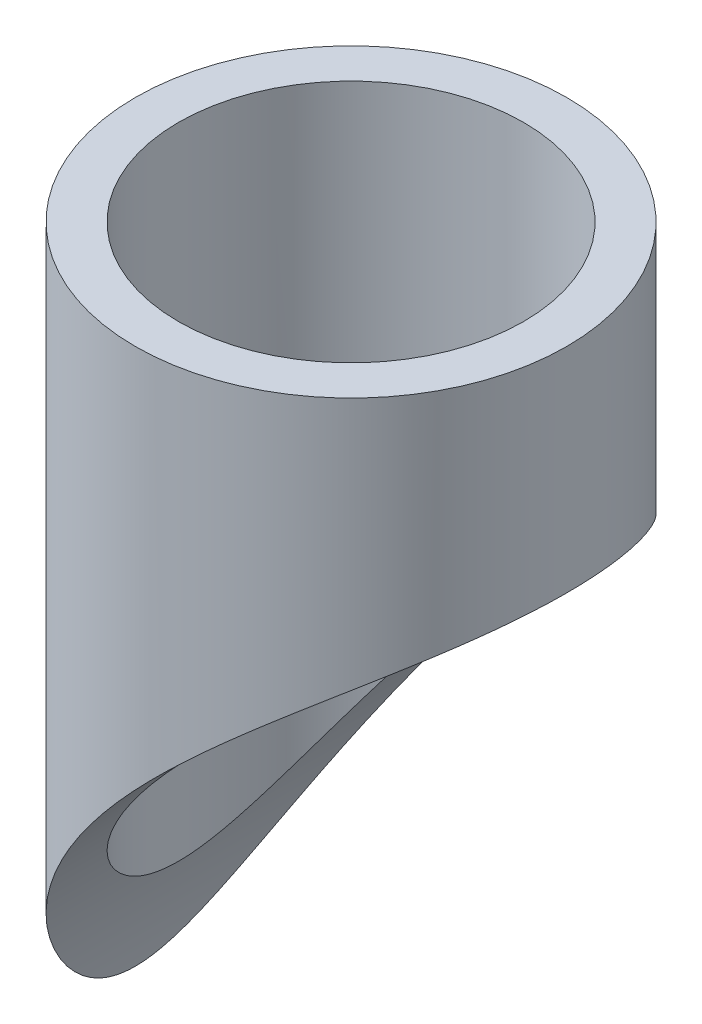
ISO-10303-21;
HEADER;
FILE_DESCRIPTION(('STEP AP214'),'2;1');
FILE_NAME('part.step','',(''),(''),'','','');
FILE_SCHEMA(('AUTOMOTIVE_DESIGN { 1 0 10303 214 1 1 1 1 }'));
ENDSEC;
DATA;
#1=APPLICATION_CONTEXT('core data for automotive mechanical design processes');
#2=APPLICATION_PROTOCOL_DEFINITION('international standard','automotive_design',2000,#1);
#3=PRODUCT_CONTEXT('',#1,'mechanical');
#4=PRODUCT('Part','Part','',(#3));
#5=PRODUCT_RELATED_PRODUCT_CATEGORY('part','',(#4));
#6=PRODUCT_DEFINITION_FORMATION('','',#4);
#7=PRODUCT_DEFINITION_CONTEXT('part definition',#1,'design');
#8=PRODUCT_DEFINITION('design','',#6,#7);
#9=PRODUCT_DEFINITION_SHAPE('','',#8);
#10=(LENGTH_UNIT() NAMED_UNIT(*) SI_UNIT(.MILLI.,.METRE.));
#11=(NAMED_UNIT(*) PLANE_ANGLE_UNIT() SI_UNIT($,.RADIAN.));
#12=(NAMED_UNIT(*) SI_UNIT($,.STERADIAN.) SOLID_ANGLE_UNIT());
#13=UNCERTAINTY_MEASURE_WITH_UNIT(LENGTH_MEASURE(1.E-05),#10,'distance_accuracy_value','');
#14=(GEOMETRIC_REPRESENTATION_CONTEXT(3) GLOBAL_UNCERTAINTY_ASSIGNED_CONTEXT((#13)) GLOBAL_UNIT_ASSIGNED_CONTEXT((#10,
#11,#12)) REPRESENTATION_CONTEXT('',''));
#15=CARTESIAN_POINT('',(0.,0.,0.));
#16=DIRECTION('',(0.,0.,1.));
#17=DIRECTION('',(1.,0.,0.));
#18=AXIS2_PLACEMENT_3D('',#15,#16,#17);
#19=CARTESIAN_POINT('',(0.,76.2,0.));
#20=DIRECTION('',(0.,1.,0.));
#21=DIRECTION('',(0.,0.,1.));
#22=AXIS2_PLACEMENT_3D('',#19,#20,#21);
#23=PLANE('',#22);
#24=CARTESIAN_POINT('',(0.,76.2,0.));
#25=DIRECTION('',(0.,1.,0.));
#26=DIRECTION('',(0.,0.,1.));
#27=AXIS2_PLACEMENT_3D('',#24,#25,#26);
#28=CIRCLE('',#27,15.875);
#29=CARTESIAN_POINT('',(0.,76.2,15.875));
#30=VERTEX_POINT('',#29);
#31=EDGE_CURVE('E10',#30,#30,#28,.T.);
#32=ORIENTED_EDGE('',*,*,#31,.T.);
#33=EDGE_LOOP('',(#32));
#34=FACE_BOUND('',#33,.T.);
#35=CARTESIAN_POINT('',(0.,76.2,0.));
#36=DIRECTION('',(0.,1.,0.));
#37=DIRECTION('',(0.,0.,1.));
#38=AXIS2_PLACEMENT_3D('',#35,#36,#37);
#39=CIRCLE('',#38,12.7);
#40=CARTESIAN_POINT('',(0.,76.2,12.7));
#41=VERTEX_POINT('',#40);
#42=EDGE_CURVE('E45',#41,#41,#39,.T.);
#43=ORIENTED_EDGE('',*,*,#42,.F.);
#44=EDGE_LOOP('',(#43));
#45=FACE_BOUND('',#44,.T.);
#46=ADVANCED_FACE('F31',(#34,#45),#23,.T.);
#47=CARTESIAN_POINT('',(0.,76.2,0.));
#48=DIRECTION('',(0.,-1.,0.));
#49=DIRECTION('',(0.,0.,-1.));
#50=AXIS2_PLACEMENT_3D('',#47,#48,#49);
#51=CYLINDRICAL_SURFACE('',#50,15.875);
#52=ORIENTED_EDGE('',*,*,#31,.F.);
#53=EDGE_LOOP('',(#52));
#54=FACE_BOUND('',#53,.T.);
#55=CARTESIAN_POINT('',(0.,47.9414486639693,-15.875));
#56=CARTESIAN_POINT('',(-0.66666065135991,47.2350268969374,-15.8750045128508));
#57=CARTESIAN_POINT('',(-1.31875367673351,46.514456727453,-15.8330474446576));
#58=CARTESIAN_POINT('',(-2.58879091738679,45.0510828408319,-15.6755798825106));
#59=CARTESIAN_POINT('',(-3.20670434630285,44.3082599793599,-15.5600042143886));
#60=CARTESIAN_POINT('',(-4.40802378042113,42.8022054103682,-15.26333797029));
#61=CARTESIAN_POINT('',(-4.99125279163666,42.0388938049038,-15.0819401754127));
#62=CARTESIAN_POINT('',(-6.11835287787962,40.4997928206583,-14.6609440469602));
#63=CARTESIAN_POINT('',(-6.66223383073967,39.7240066336529,-14.4213603864714));
#64=CARTESIAN_POINT('',(-7.52141247118628,38.4447299536941,-13.9851800542793));
#65=CARTESIAN_POINT('',(-7.84851707547663,37.943748029368,-13.804155000241));
#66=CARTESIAN_POINT('',(-8.4863624260355,36.9391885914301,-13.4214618279639));
#67=CARTESIAN_POINT('',(-8.79710220074957,36.4356109256572,-13.2197924861936));
#68=CARTESIAN_POINT('',(-9.4023771474737,35.4265818334641,-12.7963842438004));
#69=CARTESIAN_POINT('',(-9.69689974260107,34.9211292684219,-12.5746301097533));
#70=CARTESIAN_POINT('',(-10.2694647630176,33.9098886006426,-12.1115358224614));
#71=CARTESIAN_POINT('',(-10.5475077615438,33.4041005101961,-11.8701963511785));
#72=CARTESIAN_POINT('',(-11.0871496645307,32.3933858330129,-11.3677919023488));
#73=CARTESIAN_POINT('',(-11.3487451701882,31.8884594451784,-11.1067228721572));
#74=CARTESIAN_POINT('',(-11.8553755410638,30.8811307517034,-10.5642550021301));
#75=CARTESIAN_POINT('',(-12.1004088034614,30.3787286946991,-10.2828542001123));
#76=CARTESIAN_POINT('',(-12.5734173411913,29.3792066050073,-9.69875743402519));
#77=CARTESIAN_POINT('',(-12.801412669277,28.8820809731921,-9.39608734402429));
#78=CARTESIAN_POINT('',(-13.240252726423,27.8955136849343,-8.76690148894639));
#79=CARTESIAN_POINT('',(-13.4511020078049,27.4060700169431,-8.44039209724893));
#80=CARTESIAN_POINT('',(-13.8164988587507,26.5313134400782,-7.82448318507253));
#81=CARTESIAN_POINT('',(-13.9741206523707,26.1439238690001,-7.5398614486379));
#82=CARTESIAN_POINT('',(-14.2771055144478,25.380333162619,-6.94912472428214));
#83=CARTESIAN_POINT('',(-14.4224619025835,25.0041381957128,-6.64299818803477));
#84=CARTESIAN_POINT('',(-14.6298574673211,24.4539264460913,-6.16544009326816));
#85=CARTESIAN_POINT('',(-14.6970276936404,24.2733976442888,-6.0037125755573));
#86=CARTESIAN_POINT('',(-14.8277702780036,23.9176529451846,-5.67313651696569));
#87=CARTESIAN_POINT('',(-14.8913431576044,23.7424362794279,-5.50428901459432));
#88=CARTESIAN_POINT('',(-15.0145261994738,23.3988017682531,-5.15880050222244));
#89=CARTESIAN_POINT('',(-15.0741407316203,23.2303765088648,-4.98216845709812));
#90=CARTESIAN_POINT('',(-15.1890566443287,22.9019026222129,-4.6199867485452));
#91=CARTESIAN_POINT('',(-15.2443594492054,22.7418512345615,-4.4344400629507));
#92=CARTESIAN_POINT('',(-15.3345096453927,22.4780434789594,-4.10948611620984));
#93=CARTESIAN_POINT('',(-15.3705807859744,22.3716018826797,-3.97260384630213));
#94=CARTESIAN_POINT('',(-15.4400346656773,22.1651123622437,-3.69345612619952));
#95=CARTESIAN_POINT('',(-15.4734174702423,22.0650642824586,-3.55119080717138));
#96=CARTESIAN_POINT('',(-15.5691647138832,21.7760743379903,-3.11536774715303));
#97=CARTESIAN_POINT('',(-15.6270558920996,21.5984989458554,-2.81303720721557));
#98=CARTESIAN_POINT('',(-15.7281586289646,21.2850753776152,-2.17825771381201));
#99=CARTESIAN_POINT('',(-15.7711350593105,21.1498985347196,-1.84542256659295));
#100=CARTESIAN_POINT('',(-15.8200536462718,20.9950916332291,-1.33088154399303));
#101=CARTESIAN_POINT('',(-15.8337618954994,20.9515052995447,-1.15703062139832));
#102=CARTESIAN_POINT('',(-15.8555309637987,20.8821463356121,-0.805421447664819));
#103=CARTESIAN_POINT('',(-15.8635932852847,20.856368966319,-0.627664249004634));
#104=CARTESIAN_POINT('',(-15.8731382514911,20.8258338152418,-0.290360150437818));
#105=CARTESIAN_POINT('',(-15.8752589751626,20.8190378810528,-0.13101389303826));
#106=CARTESIAN_POINT('',(-15.8746906451783,20.8208580877462,0.187574548862955));
#107=CARTESIAN_POINT('',(-15.8720020104055,20.829472886393,0.346816741219976));
#108=CARTESIAN_POINT('',(-15.8619106584243,20.86174600207,0.663770600228167));
#109=CARTESIAN_POINT('',(-15.8545029197951,20.8854203433535,0.821480454675322));
#110=CARTESIAN_POINT('',(-15.8352257624824,20.9468426584602,1.133921313059));
#111=CARTESIAN_POINT('',(-15.8233535634376,20.9845994023538,1.28865039738541));
#112=CARTESIAN_POINT('',(-15.7933774004104,21.0795496712737,1.6174422291888));
#113=CARTESIAN_POINT('',(-15.7745975540601,21.13883420337,1.7908373189623));
#114=CARTESIAN_POINT('',(-15.7322020785145,21.2718942934136,2.13141674852351));
#115=CARTESIAN_POINT('',(-15.7085827251764,21.3456810094244,2.29859618742624));
#116=CARTESIAN_POINT('',(-15.6313332633482,21.5853745206631,2.79059444248092));
#117=CARTESIAN_POINT('',(-15.5713416272364,21.7695185267103,3.10556698064165));
#118=CARTESIAN_POINT('',(-15.442950071752,22.1570089314821,3.68977112018473));
#119=CARTESIAN_POINT('',(-15.3753858384714,22.3582340667913,3.96065409238582));
#120=CARTESIAN_POINT('',(-15.2310568996593,22.7809562072674,4.48376197985572));
#121=CARTESIAN_POINT('',(-15.1542836067887,23.0024720871088,4.73596912016705));
#122=CARTESIAN_POINT('',(-14.9927423400133,23.4605363715501,5.22492075875693));
#123=CARTESIAN_POINT('',(-14.9079511926085,23.6971276625542,5.46161686858621));
#124=CARTESIAN_POINT('',(-14.7315037384017,24.1807949047832,5.92105467399209));
#125=CARTESIAN_POINT('',(-14.6398498015873,24.4278672238422,6.14380113856841));
#126=CARTESIAN_POINT('',(-14.4075244605822,25.0430140078842,6.67509215580451));
#127=CARTESIAN_POINT('',(-14.2633770541851,25.4154408768356,6.97706457446801));
#128=CARTESIAN_POINT('',(-13.9629537974177,26.1715130731179,7.56036114498434));
#129=CARTESIAN_POINT('',(-13.806672968245,26.5551629650075,7.84167672744087));
#130=CARTESIAN_POINT('',(-13.4824252828439,27.3307382754771,8.38692816574423));
#131=CARTESIAN_POINT('',(-13.3144409148361,27.722675456257,8.65083677533946));
#132=CARTESIAN_POINT('',(-12.9674197743992,28.5118309134827,9.16281806378762));
#133=CARTESIAN_POINT('',(-12.7883846502163,28.909048395458,9.41089309308302));
#134=CARTESIAN_POINT('',(-12.4189722531972,29.7082207041605,9.89329449681348));
#135=CARTESIAN_POINT('',(-12.2285656774532,30.1101854220727,10.127581964284));
#136=CARTESIAN_POINT('',(-11.8369795925162,30.9165360366939,10.5826095091102));
#137=CARTESIAN_POINT('',(-11.6357997439983,31.3209220093084,10.8033491592809));
#138=CARTESIAN_POINT('',(-11.2229188655453,32.1307711296429,11.2316567088521));
#139=CARTESIAN_POINT('',(-11.0112267490892,32.5362330979062,11.4392354386373));
#140=CARTESIAN_POINT('',(-10.5771910872255,33.3477840154308,11.8417163315733));
#141=CARTESIAN_POINT('',(-10.3548468160334,33.7538730055845,12.0366176288082));
#142=CARTESIAN_POINT('',(-9.89097283657847,34.5812317152349,12.4208844977213));
#143=CARTESIAN_POINT('',(-9.64903612336731,35.0024982798607,12.6097665956041));
#144=CARTESIAN_POINT('',(-9.15373385733811,35.8442587453432,12.9737894717217));
#145=CARTESIAN_POINT('',(-8.90036755368368,36.2647525935444,13.1489293451213));
#146=CARTESIAN_POINT('',(-8.12300472591021,37.5243285112409,13.6533657985792));
#147=CARTESIAN_POINT('',(-7.58179697303059,38.3614106937945,13.9616354473012));
#148=CARTESIAN_POINT('',(-6.45551210035947,40.0229165356587,14.5167152278554));
#149=CARTESIAN_POINT('',(-5.87055449705109,40.8473677668844,14.7636853738333));
#150=CARTESIAN_POINT('',(-4.6565144012067,42.4809612750072,15.19033473294));
#151=CARTESIAN_POINT('',(-4.02744740496635,43.2901088027337,15.3700374388964));
#152=CARTESIAN_POINT('',(-2.89103776783719,44.6865659913839,15.617463415055));
#153=CARTESIAN_POINT('',(-2.39292474717176,45.2784366798749,15.701988814606));
#154=CARTESIAN_POINT('',(-1.37467113806686,46.4481120253193,15.8236788428069));
#155=CARTESIAN_POINT('',(-0.854530588114299,47.0259167068463,15.8608435542027));
#156=CARTESIAN_POINT('',(0.205135750647502,48.1641628995572,15.8825145919074));
#157=CARTESIAN_POINT('',(0.744653150092596,48.7246117339521,15.8670434417677));
#158=CARTESIAN_POINT('',(1.83971045675661,49.8248365138395,15.777601679473));
#159=CARTESIAN_POINT('',(2.3952461588794,50.3646177998631,15.7036462881745));
#160=CARTESIAN_POINT('',(3.3891469934105,51.2989951073759,15.5152633901721));
#161=CARTESIAN_POINT('',(3.82529980387192,51.698597590999,15.4139342842937));
#162=CARTESIAN_POINT('',(4.7010984984568,52.4810293378575,15.1697710502473));
#163=CARTESIAN_POINT('',(5.14074422697473,52.8638593433928,15.0269387610261));
#164=CARTESIAN_POINT('',(6.01925745534077,53.6100656582846,14.6970727953055));
#165=CARTESIAN_POINT('',(6.45812526772586,53.9734639117534,14.5100903278931));
#166=CARTESIAN_POINT('',(7.11244419444058,54.5022826542545,14.1946259938396));
#167=CARTESIAN_POINT('',(7.32987811447742,54.6758358666363,14.0836445662315));
#168=CARTESIAN_POINT('',(7.76284946320285,55.0172897978307,13.8497060074125));
#169=CARTESIAN_POINT('',(7.97838639511147,55.1851890667292,13.7267458353377));
#170=CARTESIAN_POINT('',(8.53756348250257,55.6156300243116,13.3898388281348));
#171=CARTESIAN_POINT('',(8.87909834445058,55.8733898923915,13.1661641697728));
#172=CARTESIAN_POINT('',(9.5517626050313,56.3718073749593,12.6866086926024));
#173=CARTESIAN_POINT('',(9.8828941340963,56.6124685038915,12.4307345221609));
#174=CARTESIAN_POINT('',(10.5311497052201,57.0753959420346,11.8865291833914));
#175=CARTESIAN_POINT('',(10.8482735273705,57.2976619625067,11.5981975057617));
#176=CARTESIAN_POINT('',(11.4645196234674,57.7224616249204,10.9894487153382));
#177=CARTESIAN_POINT('',(11.7636415842187,57.9249949235913,10.6690310445726));
#178=CARTESIAN_POINT('',(12.3418498459457,58.3105037355934,9.99465190667703));
#179=CARTESIAN_POINT('',(12.6207722905057,58.4933241566574,9.64046068926702));
#180=CARTESIAN_POINT('',(13.1518503632201,58.8365477634936,8.9023120685481));
#181=CARTESIAN_POINT('',(13.4040052646117,58.9969503406386,8.51835385752812));
#182=CARTESIAN_POINT('',(13.8772714236556,59.2942892558562,7.72339611914459));
#183=CARTESIAN_POINT('',(14.0983964709165,59.4312360236522,7.31240872351999));
#184=CARTESIAN_POINT('',(14.505851781255,59.6809389493783,6.46654196057116));
#185=CARTESIAN_POINT('',(14.6921872962065,59.793698758987,6.03166621231331));
#186=CARTESIAN_POINT('',(15.005452163152,59.9816791913232,5.19848625540537));
#187=CARTESIAN_POINT('',(15.1369196335125,60.0598478078819,4.80254510643648));
#188=CARTESIAN_POINT('',(15.3688957579708,60.1969894815053,3.99846206945098));
#189=CARTESIAN_POINT('',(15.4694071694962,60.2559642482992,3.5903212716797));
#190=CARTESIAN_POINT('',(15.6379726228009,60.3544851175854,2.76526072161523));
#191=CARTESIAN_POINT('',(15.7060397185789,60.3940390342669,2.34834457071411));
#192=CARTESIAN_POINT('',(15.8087681015191,60.4536164545046,1.50903641444847));
#193=CARTESIAN_POINT('',(15.8434307511566,60.4736407546206,1.08664463313206));
#194=CARTESIAN_POINT('',(15.8775182712816,60.4933309485588,0.271621901646771));
#195=CARTESIAN_POINT('',(15.8793815182309,60.4944056093163,-0.120875714094932));
#196=CARTESIAN_POINT('',(15.8540534672785,60.4797779716364,-0.904601746974085));
#197=CARTESIAN_POINT('',(15.8268640043489,60.4640767327664,-1.29583024270394));
#198=CARTESIAN_POINT('',(15.7437868981974,60.4159475267913,-2.07411064574538));
#199=CARTESIAN_POINT('',(15.6879044845395,60.3835226077316,-2.46116330102317));
#200=CARTESIAN_POINT('',(15.5481536450644,60.3020427448373,-3.22840368812439));
#201=CARTESIAN_POINT('',(15.4642849304676,60.2529876294023,-3.608591349068));
#202=CARTESIAN_POINT('',(15.2706314185859,60.1389968254308,-4.35554282757884));
#203=CARTESIAN_POINT('',(15.1611258259927,60.074231971045,-4.72240525271312));
#204=CARTESIAN_POINT('',(14.9170693446605,59.9287739661364,-5.44443669924268));
#205=CARTESIAN_POINT('',(14.7825188776715,59.8480810838368,-5.79960591743043));
#206=CARTESIAN_POINT('',(14.4899556204419,59.6710347712088,-6.49611434443514));
#207=CARTESIAN_POINT('',(14.3319416768472,59.5746805710217,-6.83745287235001));
#208=CARTESIAN_POINT('',(13.9942690570408,59.3666570983852,-7.50438402046928));
#209=CARTESIAN_POINT('',(13.8146097455178,59.254987376398,-7.82997617811009));
#210=CARTESIAN_POINT('',(13.4278245262629,59.011840186948,-8.47684772235653));
#211=CARTESIAN_POINT('',(13.2198721469286,58.8797363532134,-8.79739721983744));
#212=CARTESIAN_POINT('',(12.7850368541985,58.5999308955367,-9.41817874811295));
#213=CARTESIAN_POINT('',(12.5581535759216,58.4522289709365,-9.71841038709161));
#214=CARTESIAN_POINT('',(12.0879014264708,58.1418547095999,-10.2974451484425));
#215=CARTESIAN_POINT('',(11.8445321075478,57.9791819662235,-10.5762476883764));
#216=CARTESIAN_POINT('',(11.3437479825905,57.6395543215934,-11.1116790560152));
#217=CARTESIAN_POINT('',(11.086331507926,57.4625977223905,-11.368305240045));
#218=CARTESIAN_POINT('',(10.5337587589379,57.0769371170622,-11.8832638998662));
#219=CARTESIAN_POINT('',(10.2373912941697,56.8668249971123,-12.1392422873671));
#220=CARTESIAN_POINT('',(9.63366360876956,56.431319441915,-12.6237073965762));
#221=CARTESIAN_POINT('',(9.32630290123263,56.2059253294114,-12.8521928986278));
#222=CARTESIAN_POINT('',(8.70318230664155,55.7407541990041,-13.2820789152309));
#223=CARTESIAN_POINT('',(8.38741612800914,55.5009662284872,-13.4834584165642));
#224=CARTESIAN_POINT('',(7.75026907174175,55.0082313481802,-13.8595044151506));
#225=CARTESIAN_POINT('',(7.42888718010745,54.7552820452652,-14.034166031383));
#226=CARTESIAN_POINT('',(6.63094948438063,54.1155006083188,-14.4335750125358));
#227=CARTESIAN_POINT('',(6.15245664227602,53.7216210635852,-14.6432788093122));
#228=CARTESIAN_POINT('',(5.19456656784212,52.9108795212126,-15.0098418441656));
#229=CARTESIAN_POINT('',(4.71516901469862,52.494006736472,-15.1666760292369));
#230=CARTESIAN_POINT('',(3.76062909019786,51.6403921017693,-15.4310909887219));
#231=CARTESIAN_POINT('',(3.28548678962633,51.2036499220137,-15.5386709452825));
#232=CARTESIAN_POINT('',(2.34354346021446,50.3131613226583,-15.7083532086637));
#233=CARTESIAN_POINT('',(1.87673896909312,49.8594222154524,-15.7704748415689));
#234=CARTESIAN_POINT('',(1.1762957965288,49.1591812000264,-15.8331820578484));
#235=CARTESIAN_POINT('',(0.938545026288685,48.9180185374613,-15.8489942870651));
#236=CARTESIAN_POINT('',(0.466608354857252,48.4322907123422,-15.8698966794377));
#237=CARTESIAN_POINT('',(0.232418874441163,48.187729514113,-15.8749984266783));
#238=CARTESIAN_POINT('',(0.,47.9414486639693,-15.875));
#239=B_SPLINE_CURVE_WITH_KNOTS('',3,(#55,#56,#57,#58,#59,#60,#61,#62,#63,#64,#65,#66,#67,#68,
#69,#70,#71,#72,#73,#74,#75,#76,#77,#78,#79,#80,#81,#82,#83,#84,#85,#86,#87,#88,#89,#90,#91,#92,
#93,#94,#95,#96,#97,#98,#99,#100,#101,#102,#103,#104,#105,#106,#107,#108,#109,#110,#111,#112,
#113,#114,#115,#116,#117,#118,#119,#120,#121,#122,#123,#124,#125,#126,#127,#128,#129,#130,#131,
#132,#133,#134,#135,#136,#137,#138,#139,#140,#141,#142,#143,#144,#145,#146,#147,#148,#149,#150,
#151,#152,#153,#154,#155,#156,#157,#158,#159,#160,#161,#162,#163,#164,#165,#166,#167,#168,#169,
#170,#171,#172,#173,#174,#175,#176,#177,#178,#179,#180,#181,#182,#183,#184,#185,#186,#187,#188,
#189,#190,#191,#192,#193,#194,#195,#196,#197,#198,#199,#200,#201,#202,#203,#204,#205,#206,#207,
#208,#209,#210,#211,#212,#213,#214,#215,#216,#217,#218,#219,#220,#221,#222,#223,#224,#225,#226,
#227,#228,#229,#230,#231,#232,#233,#234,#235,#236,#237,#238),.UNSPECIFIED.,.T.,.F.,(4,2,2,2,2,2,
2,2,2,2,2,2,2,2,2,2,2,2,2,2,2,2,2,2,2,2,2,2,2,2,2,2,2,2,2,2,2,2,2,2,2,2,2,2,2,2,2,2,2,2,2,2,2,2,
2,2,2,2,2,2,2,2,2,2,2,2,2,2,2,2,2,2,2,2,2,2,2,2,2,2,2,2,2,2,2,2,2,2,2,2,2,4),(0.,
2.91361950347819,5.82982201112205,8.75981449672622,11.6890688739846,13.5638619909207,
15.4387662862201,17.3151047157014,19.191377839043,21.0680374203324,22.9448783571598,
24.8194743757091,26.6935710478311,28.2106929481234,29.7286358820966,30.4830285899826,
31.2373116414263,31.9907476488177,32.7439337059436,33.2750616986507,33.8061767578819,
34.8694185270659,35.9487324800133,36.4871399647719,37.0254041216568,37.5031243953401,
37.9808030628276,38.4589908611322,38.937476958119,39.4892338131058,40.0414168667076,
41.146738223344,42.1777996464699,43.2098301076638,44.2449402820814,45.2796946269593,
46.7807653603763,48.2824553288387,49.7864426144224,51.2902061163122,52.7980275002163,
54.3058964037971,55.8125078999992,57.3192221955591,58.8825730426139,60.4460267398059,
63.5732829473031,66.692287926635,69.8102025900183,72.1431074284387,74.4760081909312,
76.8079108012388,79.1392067202724,80.9381423029601,82.7369981895341,84.5337777733136,
85.4320959318481,86.3306427301097,87.7776158561952,89.2242907084333,90.6709882640986,
92.1177109820416,93.5750928637647,95.0325143045963,96.4892860049587,97.9458376110087,
99.2175346894612,100.489118458027,101.76019017098,103.031210038222,104.207304380352,
105.383324444639,106.559130244094,107.734948176596,108.89851183581,110.062055902646,
111.225657182777,112.389292623991,113.600852273343,114.812435280135,116.024051205858,
117.235811371361,118.56772855309,119.899704800389,121.232707752412,122.565953937176,
124.525838904434,126.486651289404,128.447496231948,130.407507058677,131.424386861961,
132.44016627562),.UNSPECIFIED.);
#240=CARTESIAN_POINT('',(0.,47.9414486639693,-15.875));
#241=VERTEX_POINT('',#240);
#242=EDGE_CURVE('E49',#241,#241,#239,.T.);
#243=ORIENTED_EDGE('',*,*,#242,.T.);
#244=EDGE_LOOP('',(#243));
#245=FACE_BOUND('',#244,.T.);
#246=ADVANCED_FACE('F33',(#54,#245),#51,.T.);
#247=CARTESIAN_POINT('',(0.,76.2,0.));
#248=DIRECTION('',(0.,-1.,0.));
#249=DIRECTION('',(0.,0.,-1.));
#250=AXIS2_PLACEMENT_3D('',#247,#248,#249);
#251=CYLINDRICAL_SURFACE('',#250,12.7);
#252=CARTESIAN_POINT('',(0.,47.9414486639693,-12.7));
#253=CARTESIAN_POINT('',(-0.538939033689647,47.3703749887611,-12.6999982291483));
#254=CARTESIAN_POINT('',(-1.06816791353537,46.7902525097512,-12.6657456535846));
#255=CARTESIAN_POINT('',(-2.10366280657467,45.6162055331657,-12.5354346776843));
#256=CARTESIAN_POINT('',(-2.60991500531772,45.0222730486733,-12.4393396087754));
#257=CARTESIAN_POINT('',(-3.59840067813975,43.8228566912171,-12.1902527535142));
#258=CARTESIAN_POINT('',(-4.08054059456745,43.2173387917118,-12.0370563095705));
#259=CARTESIAN_POINT('',(-5.01707425862054,42.0007817340923,-11.6777787939843));
#260=CARTESIAN_POINT('',(-5.47147454789113,41.389743917026,-11.4717102509097));
#261=CARTESIAN_POINT('',(-6.13845408008293,40.462161592001,-11.1209325108562));
#262=CARTESIAN_POINT('',(-6.36169395513955,40.1461237517162,-10.9947526716761));
#263=CARTESIAN_POINT('',(-6.80031109016822,39.5142314947554,-10.7290044431812));
#264=CARTESIAN_POINT('',(-7.01568895443263,39.1983770658262,-10.5894370858661));
#265=CARTESIAN_POINT('',(-7.4385409811833,38.5673333348779,-10.2968080767626));
#266=CARTESIAN_POINT('',(-7.64601054783087,38.2521445172148,-10.1437387446162));
#267=CARTESIAN_POINT('',(-8.0527307687697,37.6233804268829,-9.82397321933542));
#268=CARTESIAN_POINT('',(-8.25198157090308,37.3098051252785,-9.65727727148257));
#269=CARTESIAN_POINT('',(-8.64190342772565,36.6853921378541,-9.30997476130307));
#270=CARTESIAN_POINT('',(-8.83258036972658,36.3745526951381,-9.12937798251513));
#271=CARTESIAN_POINT('',(-9.20522212623156,35.7564823309675,-8.75350995876061));
#272=CARTESIAN_POINT('',(-9.38718625683293,35.4492516942059,-8.55823756492877));
#273=CARTESIAN_POINT('',(-9.74180472801844,34.8401553025108,-8.15228917561137));
#274=CARTESIAN_POINT('',(-9.91446831998758,34.538284424354,-7.9416289972452));
#275=CARTESIAN_POINT('',(-10.250082095222,33.9415247330161,-7.50346428755175));
#276=CARTESIAN_POINT('',(-10.4130345787695,33.6466342764302,-7.27596377407163));
#277=CARTESIAN_POINT('',(-10.7259701997453,33.0708801714891,-6.80602814096223));
#278=CARTESIAN_POINT('',(-10.8761172000323,32.7898687412518,-6.56388472665748));
#279=CARTESIAN_POINT('',(-11.1651654604265,32.2403028872902,-6.05918378765659));
#280=CARTESIAN_POINT('',(-11.3040623437686,31.971753328942,-5.79661839509074));
#281=CARTESIAN_POINT('',(-11.5680828545269,31.4535970675219,-5.24987318345957));
#282=CARTESIAN_POINT('',(-11.6932778852622,31.2038944955712,-4.96581989036305));
#283=CARTESIAN_POINT('',(-11.9280188138458,30.7292699113729,-4.37197120490409));
#284=CARTESIAN_POINT('',(-12.0375855212016,30.5043150400343,-4.06221092858774));
#285=CARTESIAN_POINT('',(-12.2260687560987,30.1127714739201,-3.45021346167076));
#286=CARTESIAN_POINT('',(-12.3070441256423,29.9424670444677,-3.15102364696986));
#287=CARTESIAN_POINT('',(-12.4497151261425,29.6399077951104,-2.52901787339595));
#288=CARTESIAN_POINT('',(-12.5114167380012,29.5076411725836,-2.20620928219577));
#289=CARTESIAN_POINT('',(-12.5861921879335,29.3464942018312,-1.70497136112003));
#290=CARTESIAN_POINT('',(-12.6082426036396,29.2987925756855,-1.53382705429545));
#291=CARTESIAN_POINT('',(-12.645561538712,29.2178920078632,-1.18745507082294));
#292=CARTESIAN_POINT('',(-12.6608337700113,29.1846851286021,-1.01222968456888));
#293=CARTESIAN_POINT('',(-12.6841110210184,29.1340167772372,-0.659228832357186));
#294=CARTESIAN_POINT('',(-12.6921243285414,29.1165373486025,-0.481456510612338));
#295=CARTESIAN_POINT('',(-12.7006375348089,29.0979662942677,-0.124880816732975));
#296=CARTESIAN_POINT('',(-12.7011382991084,29.09687278067,0.0539224342486492));
#297=CARTESIAN_POINT('',(-12.6950077347494,29.1102478814126,0.389058761734842));
#298=CARTESIAN_POINT('',(-12.6892343870581,29.1228444057343,0.54548594007455));
#299=CARTESIAN_POINT('',(-12.672039785143,29.1602994746844,0.856574111572554));
#300=CARTESIAN_POINT('',(-12.6606167115873,29.1851619692094,1.01123451936874));
#301=CARTESIAN_POINT('',(-12.618258674022,29.2771531968955,1.47108780224443));
#302=CARTESIAN_POINT('',(-12.5792349468764,29.3616855539018,1.77215017657742));
#303=CARTESIAN_POINT('',(-12.463773589099,29.609833654579,2.47304537933614));
#304=CARTESIAN_POINT('',(-12.3786470695447,29.7914964448744,2.86493881216636));
#305=CARTESIAN_POINT('',(-12.2308470837759,30.1022954913119,3.42549471893126));
#306=CARTESIAN_POINT('',(-12.1781235691107,30.2124959601996,3.60808183057889));
#307=CARTESIAN_POINT('',(-12.0667769096044,30.4435097071613,3.96455316680761));
#308=CARTESIAN_POINT('',(-12.0081546168122,30.5643214521701,4.13843864287879));
#309=CARTESIAN_POINT('',(-11.8369372823142,30.9143826310669,4.61327344315046));
#310=CARTESIAN_POINT('',(-11.7185719029428,31.1532980018578,4.90500657758042));
#311=CARTESIAN_POINT('',(-11.468169308497,31.6508357649269,5.46490335343795));
#312=CARTESIAN_POINT('',(-11.3361207602309,31.9094744456121,5.73304711140659));
#313=CARTESIAN_POINT('',(-11.0600530811907,32.4414297694549,6.24908114524991));
#314=CARTESIAN_POINT('',(-10.916006567546,32.7147794552399,6.49692238017649));
#315=CARTESIAN_POINT('',(-10.6175723156586,33.2716718161719,6.97397144674833));
#316=CARTESIAN_POINT('',(-10.4631867843123,33.5552123101095,7.20318323193259));
#317=CARTESIAN_POINT('',(-10.1496625485025,34.1212943286674,7.63832981414469));
#318=CARTESIAN_POINT('',(-9.99080132510597,34.4036152666325,7.8447538424016));
#319=CARTESIAN_POINT('',(-9.66468699461334,34.9735895802437,8.24318508477563));
#320=CARTESIAN_POINT('',(-9.49743247041785,35.2612438511491,8.43518985063392));
#321=CARTESIAN_POINT('',(-9.15483783043912,35.8406653184859,8.80583136742623));
#322=CARTESIAN_POINT('',(-8.97949203006839,36.1324353033635,8.98445848138062));
#323=CARTESIAN_POINT('',(-8.6211327150616,36.7187902207817,9.32887023250513));
#324=CARTESIAN_POINT('',(-8.43811961002796,37.0133750023032,9.49465555436433));
#325=CARTESIAN_POINT('',(-8.06439430603059,37.6048949245991,9.81407393649289));
#326=CARTESIAN_POINT('',(-7.87367233687512,37.9018326384678,9.96769079550202));
#327=CARTESIAN_POINT('',(-7.48493026665034,38.4969584320957,10.2628140440784));
#328=CARTESIAN_POINT('',(-7.28690956955548,38.7951466122001,10.4043194414561));
#329=CARTESIAN_POINT('',(-6.68228906125381,39.6903896926489,10.8107833749909));
#330=CARTESIAN_POINT('',(-6.26493664501815,40.2884313340468,11.057854963859));
#331=CARTESIAN_POINT('',(-5.37610011831226,41.5196348577701,11.5175112047277));
#332=CARTESIAN_POINT('',(-4.9028644485019,42.1526801774849,11.727016033721));
#333=CARTESIAN_POINT('',(-3.92668012298323,43.4125328807865,12.0889270018852));
#334=CARTESIAN_POINT('',(-3.42372439477692,44.039338737762,12.2413194861372));
#335=CARTESIAN_POINT('',(-2.39130559835223,45.2808792099226,12.4840809635776));
#336=CARTESIAN_POINT('',(-1.86190096803312,45.8956365930595,12.5745807227661));
#337=CARTESIAN_POINT('',(-0.778747778853341,47.1096167515614,12.6877820810394));
#338=CARTESIAN_POINT('',(-0.225011599477128,47.7088471856214,12.7105177611827));
#339=CARTESIAN_POINT('',(0.718232489843585,48.6943651672989,12.6853600680413));
#340=CARTESIAN_POINT('',(1.10239833077269,49.0863597219866,12.6580844699544));
#341=CARTESIAN_POINT('',(1.87768009336039,49.8590851878527,12.5664895123434));
#342=CARTESIAN_POINT('',(2.26879554969498,50.2398168486436,12.5021726239951));
#343=CARTESIAN_POINT('',(3.05497042029434,50.9875349943674,12.3336385366897));
#344=CARTESIAN_POINT('',(3.45002613706209,51.3545330651136,12.2294558418688));
#345=CARTESIAN_POINT('',(4.24094515908358,52.0726603030011,11.9781661100493));
#346=CARTESIAN_POINT('',(4.63680826997789,52.4237929045937,11.8310684149154));
#347=CARTESIAN_POINT('',(5.34238893365297,53.0358217067883,11.5266647321586));
#348=CARTESIAN_POINT('',(5.65278667321945,53.3002162896146,11.3779470253168));
#349=CARTESIAN_POINT('',(6.26872040385878,53.8158791726684,11.0505542401421));
#350=CARTESIAN_POINT('',(6.57425665879898,54.0671481870156,10.8718807938352));
#351=CARTESIAN_POINT('',(7.17709724695162,54.5546975875707,10.4836867673706));
#352=CARTESIAN_POINT('',(7.47440872545431,54.7909912298264,10.2741940296296));
#353=CARTESIAN_POINT('',(8.05751025376864,55.2470723183262,9.82355442262107));
#354=CARTESIAN_POINT('',(8.3433022975463,55.4668626269612,9.58241306262133));
#355=CARTESIAN_POINT('',(8.8501357202486,55.8508181834173,9.11384781780333));
#356=CARTESIAN_POINT('',(9.07368382743401,56.0179429150639,8.89155176006918));
#357=CARTESIAN_POINT('',(9.50785330084127,56.3387427891652,8.42567890671373));
#358=CARTESIAN_POINT('',(9.71847709910066,56.4924204643585,8.1821061358835));
#359=CARTESIAN_POINT('',(10.1242917317071,56.7853141159322,7.67426561693121));
#360=CARTESIAN_POINT('',(10.3194832629222,56.9245307454128,7.40999880435476));
#361=CARTESIAN_POINT('',(10.6918615740645,57.187513575174,6.8617701168852));
#362=CARTESIAN_POINT('',(10.8690480379785,57.3112795042827,6.57780789645833));
#363=CARTESIAN_POINT('',(11.2039286037227,57.5431612364326,5.98975776993979));
#364=CARTESIAN_POINT('',(11.3614889491404,57.6511704251024,5.68555136873292));
#365=CARTESIAN_POINT('',(11.6532748658825,57.8496982026242,5.06064081911963));
#366=CARTESIAN_POINT('',(11.7874999451068,57.9402164226267,4.73993632298194));
#367=CARTESIAN_POINT('',(12.0302955286575,58.1029594173178,4.08461005578341));
#368=CARTESIAN_POINT('',(12.1388762081391,58.1751914484,3.74999386677499));
#369=CARTESIAN_POINT('',(12.3285099601865,58.3007712371122,3.06961126113706));
#370=CARTESIAN_POINT('',(12.4095665107366,58.3541213807179,2.72384625933629));
#371=CARTESIAN_POINT('',(12.5350714439539,58.4364842300265,2.06433471598595));
#372=CARTESIAN_POINT('',(12.5826420357462,58.4675796023534,1.75143755220772));
#373=CARTESIAN_POINT('',(12.6543208943582,58.514370156835,1.12183620239688));
#374=CARTESIAN_POINT('',(12.6784311314698,58.5300666322499,0.805132338327742));
#375=CARTESIAN_POINT('',(12.7028232741043,58.5459463679073,0.170534001032551));
#376=CARTESIAN_POINT('',(12.7031134949567,58.5461350417684,-0.147360017966909));
#377=CARTESIAN_POINT('',(12.6798821245125,58.5310115038876,-0.781904950903671));
#378=CARTESIAN_POINT('',(12.6563609733167,58.51569957864,-1.09855588770801));
#379=CARTESIAN_POINT('',(12.5877929750027,58.4709440248682,-1.71089041153902));
#380=CARTESIAN_POINT('',(12.5439919160353,58.4423178739452,-2.00677462258833));
#381=CARTESIAN_POINT('',(12.4360169018763,58.3714953129384,-2.59313401321084));
#382=CARTESIAN_POINT('',(12.3718439679728,58.3292995831269,-2.88360946316476));
#383=CARTESIAN_POINT('',(12.223963410472,58.2316043199558,-3.45723112796567));
#384=CARTESIAN_POINT('',(12.1402567677452,58.1761054545993,-3.7403777100334));
#385=CARTESIAN_POINT('',(11.9543619594603,58.0521435804858,-4.29761634265378));
#386=CARTESIAN_POINT('',(11.8521732376238,57.983680181516,-4.57170812037887));
#387=CARTESIAN_POINT('',(11.6279318068404,57.8324327802172,-5.11564004010783));
#388=CARTESIAN_POINT('',(11.5054664670812,57.7493483858122,-5.38522632068291));
#389=CARTESIAN_POINT('',(11.2439525501584,57.5705366240352,-5.91185004350315));
#390=CARTESIAN_POINT('',(11.1049038808749,57.4748091864315,-6.16888741602848));
#391=CARTESIAN_POINT('',(10.8117990559489,57.2712677362221,-6.66926402333444));
#392=CARTESIAN_POINT('',(10.6577417129274,57.1634527672355,-6.91260217192367));
#393=CARTESIAN_POINT('',(10.3362602087847,56.9363415963488,-7.38466621457992));
#394=CARTESIAN_POINT('',(10.1688344991184,56.8170440640187,-7.61339041027718));
#395=CARTESIAN_POINT('',(9.80616156711125,56.5560088287244,-8.07610330473029));
#396=CARTESIAN_POINT('',(9.60977497459544,56.4132159968661,-8.30860375383829));
#397=CARTESIAN_POINT('',(9.20515473034178,56.1155453765901,-8.75476110190808));
#398=CARTESIAN_POINT('',(8.99692065461534,55.9606671555959,-8.96841732578857));
#399=CARTESIAN_POINT('',(8.57053353975995,55.6396072413356,-9.37673334557132));
#400=CARTESIAN_POINT('',(8.35237551589142,55.4734198462828,-9.57138343685599));
#401=CARTESIAN_POINT('',(7.90813645512392,55.1306568551502,-9.94158021434884));
#402=CARTESIAN_POINT('',(7.68205403860549,54.954079446523,-10.1171235520539));
#403=CARTESIAN_POINT('',(7.12331714670244,54.5118907327384,-10.5220703500731));
#404=CARTESIAN_POINT('',(6.78735957912516,54.2411599888718,-10.7413844247143));
#405=CARTESIAN_POINT('',(6.1073725944313,53.682264067217,-11.1420769620853));
#406=CARTESIAN_POINT('',(5.76334018050837,53.3940923518901,-11.3234410847628));
#407=CARTESIAN_POINT('',(5.07085986800076,52.8022331928956,-11.650024248928));
#408=CARTESIAN_POINT('',(4.72240775790867,52.4985299587841,-11.795205587167));
#409=CARTESIAN_POINT('',(4.0248225850522,51.8779672373226,-12.0510931050802));
#410=CARTESIAN_POINT('',(3.67568963304193,51.5611097432424,-12.1618044865457));
#411=CARTESIAN_POINT('',(2.76211610283082,50.7146615140297,-12.4098314867065));
#412=CARTESIAN_POINT('',(2.19914446762364,50.1755999150794,-12.5207021191025));
#413=CARTESIAN_POINT('',(1.08755318836512,49.0745113236299,-12.6657549238582));
#414=CARTESIAN_POINT('',(0.538921827266623,48.5125041068086,-12.7000017707951));
#415=CARTESIAN_POINT('',(0.,47.9414486639693,-12.7));
#416=B_SPLINE_CURVE_WITH_KNOTS('',3,(#252,#253,#254,#255,#256,#257,#258,#259,#260,#261,#262,
#263,#264,#265,#266,#267,#268,#269,#270,#271,#272,#273,#274,#275,#276,#277,#278,#279,#280,#281,
#282,#283,#284,#285,#286,#287,#288,#289,#290,#291,#292,#293,#294,#295,#296,#297,#298,#299,#300,
#301,#302,#303,#304,#305,#306,#307,#308,#309,#310,#311,#312,#313,#314,#315,#316,#317,#318,#319,
#320,#321,#322,#323,#324,#325,#326,#327,#328,#329,#330,#331,#332,#333,#334,#335,#336,#337,#338,
#339,#340,#341,#342,#343,#344,#345,#346,#347,#348,#349,#350,#351,#352,#353,#354,#355,#356,#357,
#358,#359,#360,#361,#362,#363,#364,#365,#366,#367,#368,#369,#370,#371,#372,#373,#374,#375,#376,
#377,#378,#379,#380,#381,#382,#383,#384,#385,#386,#387,#388,#389,#390,#391,#392,#393,#394,#395,
#396,#397,#398,#399,#400,#401,#402,#403,#404,#405,#406,#407,#408,#409,#410,#411,#412,#413,#414,
#415),.UNSPECIFIED.,.T.,.F.,(4,2,2,2,2,2,2,2,2,2,2,2,2,2,2,2,2,2,2,2,2,2,2,2,2,2,2,2,2,2,2,2,2,
2,2,2,2,2,2,2,2,2,2,2,2,2,2,2,2,2,2,2,2,2,2,2,2,2,2,2,2,2,2,2,2,2,2,2,2,2,2,2,2,2,2,2,2,2,2,2,2,
4),(0.,2.35485053050023,4.71109862210793,7.07587426666784,9.44009007088053,10.6608048598408,
11.8814256234195,13.1027452489919,14.3240428954328,15.5444887052029,16.7650301560237,
17.9843342026904,19.2033482738544,20.4031600642414,21.6034364116237,22.7971257397279,
23.989210498575,25.0476983829908,26.1058574775593,26.6423094977735,27.1784673775033,
27.7140123290807,28.2494955775551,28.7200074317347,29.190670899476,30.1320054236108,
31.4450348356306,32.1037575463716,32.7623852441341,33.9460815927465,35.130766304618,
36.3182330674324,37.5054471646232,38.6573899289158,39.8095278424034,40.9624879038169,
42.1153864501931,43.2697950457438,44.424298121884,46.7321070385957,49.1827125666852,
51.6339036337575,54.079899728823,56.5246654343384,58.17204492711,59.8193145291941,
61.4651616208875,63.1106507066847,64.4115589884702,65.7123964181751,67.0120657957252,
68.3115092312709,69.3809311834455,70.4501512756122,71.519323057868,72.5885136022858,
73.6646327848491,74.7407746581379,75.8164888210475,76.8920670047053,77.8448933862101,
78.7976397387404,79.7500534956292,80.7024496495732,81.6028305523915,82.5031663242143,
83.403456896079,84.3037745696291,85.2253849938713,86.1470005378581,87.0686890527716,
87.9904844881948,88.9979973256017,90.0055462418085,91.0136069559047,92.021844051498,
93.4717211153776,94.9221450552119,96.3740741079599,97.8257839467235,100.182549282904,
102.53732463133),.UNSPECIFIED.);
#417=CARTESIAN_POINT('',(0.,47.9414486639693,-12.7));
#418=VERTEX_POINT('',#417);
#419=EDGE_CURVE('E36',#418,#418,#416,.T.);
#420=ORIENTED_EDGE('',*,*,#419,.F.);
#421=EDGE_LOOP('',(#420));
#422=FACE_BOUND('',#421,.T.);
#423=ORIENTED_EDGE('',*,*,#42,.T.);
#424=EDGE_LOOP('',(#423));
#425=FACE_BOUND('',#424,.T.);
#426=ADVANCED_FACE('F59',(#422,#425),#251,.F.);
#427=CARTESIAN_POINT('',(50.8,0.,-15.875));
#428=DIRECTION('',(0.,0.,1.));
#429=DIRECTION('',(1.,0.,0.));
#430=AXIS2_PLACEMENT_3D('',#427,#428,#429);
#431=CYLINDRICAL_SURFACE('',#430,69.85);
#432=ORIENTED_EDGE('',*,*,#419,.T.);
#433=EDGE_LOOP('',(#432));
#434=FACE_BOUND('',#433,.T.);
#435=ORIENTED_EDGE('',*,*,#242,.F.);
#436=EDGE_LOOP('',(#435));
#437=FACE_BOUND('',#436,.T.);
#438=ADVANCED_FACE('F56',(#434,#437),#431,.F.);
#439=CLOSED_SHELL('',(#46,#246,#426,#438));
#440=MANIFOLD_SOLID_BREP('B2',#439);
#441=ADVANCED_BREP_SHAPE_REPRESENTATION('',(#18,#440),#14);
#442=SHAPE_DEFINITION_REPRESENTATION(#9,#441);
ENDSEC;
END-ISO-10303-21;
